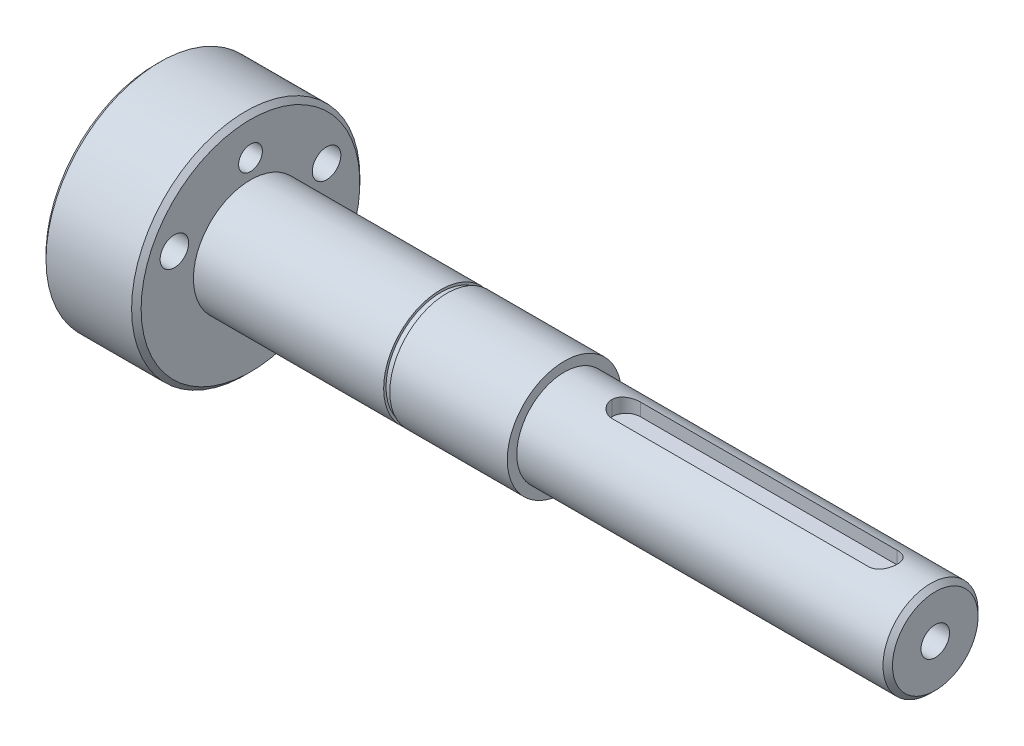
ISO-10303-21;
HEADER;
FILE_DESCRIPTION(('STEP AP214'),'2;1');
FILE_NAME('part.step','',(''),(''),'','','');
FILE_SCHEMA(('AUTOMOTIVE_DESIGN { 1 0 10303 214 1 1 1 1 }'));
ENDSEC;
DATA;
#1=APPLICATION_CONTEXT('core data for automotive mechanical design processes');
#2=APPLICATION_PROTOCOL_DEFINITION('international standard','automotive_design',2000,#1);
#3=PRODUCT_CONTEXT('',#1,'mechanical');
#4=PRODUCT('Part','Part','',(#3));
#5=PRODUCT_RELATED_PRODUCT_CATEGORY('part','',(#4));
#6=PRODUCT_DEFINITION_FORMATION('','',#4);
#7=PRODUCT_DEFINITION_CONTEXT('part definition',#1,'design');
#8=PRODUCT_DEFINITION('design','',#6,#7);
#9=PRODUCT_DEFINITION_SHAPE('','',#8);
#10=(LENGTH_UNIT() NAMED_UNIT(*) SI_UNIT(.MILLI.,.METRE.));
#11=(NAMED_UNIT(*) PLANE_ANGLE_UNIT() SI_UNIT($,.RADIAN.));
#12=(NAMED_UNIT(*) SI_UNIT($,.STERADIAN.) SOLID_ANGLE_UNIT());
#13=UNCERTAINTY_MEASURE_WITH_UNIT(LENGTH_MEASURE(1.E-05),#10,'distance_accuracy_value','');
#14=(GEOMETRIC_REPRESENTATION_CONTEXT(3) GLOBAL_UNCERTAINTY_ASSIGNED_CONTEXT((#13)) GLOBAL_UNIT_ASSIGNED_CONTEXT((#10,
#11,#12)) REPRESENTATION_CONTEXT('',''));
#15=CARTESIAN_POINT('',(0.,0.,0.));
#16=DIRECTION('',(0.,0.,1.));
#17=DIRECTION('',(1.,0.,0.));
#18=AXIS2_PLACEMENT_3D('',#15,#16,#17);
#19=CARTESIAN_POINT('',(0.,0.,0.));
#20=DIRECTION('',(-1.,0.,0.));
#21=DIRECTION('',(0.,0.,1.));
#22=AXIS2_PLACEMENT_3D('',#19,#20,#21);
#23=CYLINDRICAL_SURFACE('',#22,9.99999999999999);
#24=CARTESIAN_POINT('',(163.,0.,0.));
#25=DIRECTION('',(-1.,0.,0.));
#26=DIRECTION('',(0.,0.,1.));
#27=AXIS2_PLACEMENT_3D('',#24,#25,#26);
#28=CIRCLE('',#27,9.99999999999999);
#29=CARTESIAN_POINT('',(163.,0.,9.99999999999999));
#30=VERTEX_POINT('',#29);
#31=EDGE_CURVE('E46',#30,#30,#28,.T.);
#32=ORIENTED_EDGE('',*,*,#31,.T.);
#33=EDGE_LOOP('',(#32));
#34=FACE_BOUND('',#33,.T.);
#35=CARTESIAN_POINT('',(86.,0.,0.));
#36=DIRECTION('',(-1.,0.,0.));
#37=DIRECTION('',(0.,0.,1.));
#38=AXIS2_PLACEMENT_3D('',#35,#36,#37);
#39=CIRCLE('',#38,9.99999999999999);
#40=CARTESIAN_POINT('',(86.,0.,9.99999999999999));
#41=VERTEX_POINT('',#40);
#42=EDGE_CURVE('E119',#41,#41,#39,.T.);
#43=ORIENTED_EDGE('',*,*,#42,.F.);
#44=EDGE_LOOP('',(#43));
#45=FACE_BOUND('',#44,.T.);
#46=DIRECTION('',(-1.,0.,0.));
#47=VECTOR('',#46,1.);
#48=CARTESIAN_POINT('',(0.,9.53939201416945,3.));
#49=LINE('',#48,#47);
#50=CARTESIAN_POINT('',(99.,9.53939201416945,3.));
#51=VERTEX_POINT('',#50);
#52=CARTESIAN_POINT('',(153.,9.53939201416945,3.));
#53=VERTEX_POINT('',#52);
#54=EDGE_CURVE('E128',#51,#53,#49,.F.);
#55=ORIENTED_EDGE('',*,*,#54,.F.);
#56=CARTESIAN_POINT('',(99.,9.53939201416945,3.));
#57=CARTESIAN_POINT('',(98.9176616447206,9.53938054066292,3.00001028092919));
#58=CARTESIAN_POINT('',(98.8353298740387,9.54045779392468,2.9966103938752));
#59=CARTESIAN_POINT('',(98.671294777113,9.54470448571775,2.98307026420713));
#60=CARTESIAN_POINT('',(98.5895913136817,9.5478734536108,2.97293153783626));
#61=CARTESIAN_POINT('',(98.4276012203908,9.55620753798555,2.94602863460168));
#62=CARTESIAN_POINT('',(98.3473114611647,9.56136744728883,2.92928173841085));
#63=CARTESIAN_POINT('',(98.1885187369749,9.57351674919551,2.88932692619323));
#64=CARTESIAN_POINT('',(98.1100158186842,9.58050618952759,2.86611884160637));
#65=CARTESIAN_POINT('',(97.8780531937838,9.60391611506092,2.78708673739489));
#66=CARTESIAN_POINT('',(97.7279365869629,9.62278944217778,2.72182078022101));
#67=CARTESIAN_POINT('',(97.4407785228174,9.66493136751061,2.5681533150261));
#68=CARTESIAN_POINT('',(97.3037436309954,9.68820215546661,2.47974027229482));
#69=CARTESIAN_POINT('',(97.0422787850709,9.73733616423825,2.27930040049353));
#70=CARTESIAN_POINT('',(96.9183185453614,9.76325431599016,2.16667315014813));
#71=CARTESIAN_POINT('',(96.6907289172146,9.81429568962702,1.92227974972485));
#72=CARTESIAN_POINT('',(96.5871034948398,9.83941875564022,1.79050987481177));
#73=CARTESIAN_POINT('',(96.4010451211591,9.88667183343644,1.50818045237191));
#74=CARTESIAN_POINT('',(96.3191023734984,9.90872799691547,1.35728471100045));
#75=CARTESIAN_POINT('',(96.1819863591321,9.94670010628166,1.04312670278014));
#76=CARTESIAN_POINT('',(96.1267899026455,9.96262136883706,0.879875291166885));
#77=CARTESIAN_POINT('',(96.0574621078652,9.98287420040382,0.596528917969972));
#78=CARTESIAN_POINT('',(96.0359572833098,9.98925529459183,0.478332984300347));
#79=CARTESIAN_POINT('',(96.0072119502325,9.9978363572386,0.240114779876289));
#80=CARTESIAN_POINT('',(95.9999664864448,10.0000377781649,0.120093158182543));
#81=CARTESIAN_POINT('',(96.,9.99999999999999,0.));
#82=B_SPLINE_CURVE_WITH_KNOTS('',3,(#56,#57,#58,#59,#60,#61,#62,#63,#64,#65,#66,#67,#68,#69,#70,
#71,#72,#73,#74,#75,#76,#77,#78,#79,#80,#81),.UNSPECIFIED.,.F.,.F.,(4,2,2,2,2,2,2,2,2,2,2,2,4),
(0.,0.246926642096038,0.493797744336966,0.740027500587488,0.986263681104387,1.47812528182602,
1.97023245626458,2.47634460283145,2.98255536261057,3.49938590474304,4.0157675349931,
4.37580149197501,4.73571031156629),.UNSPECIFIED.);
#83=CARTESIAN_POINT('',(96.,9.99999999999999,0.));
#84=VERTEX_POINT('',#83);
#85=EDGE_CURVE('E61',#51,#84,#82,.T.);
#86=ORIENTED_EDGE('',*,*,#85,.T.);
#87=CARTESIAN_POINT('',(96.,9.99999999999999,0.));
#88=CARTESIAN_POINT('',(95.9999899174765,10.0000096080285,-0.082422763146378));
#89=CARTESIAN_POINT('',(96.0033965785664,9.99898119564176,-0.164839419523965));
#90=CARTESIAN_POINT('',(96.0169651310905,9.99491972682127,-0.3290491540422));
#91=CARTESIAN_POINT('',(96.0271256818352,9.99188706824365,-0.41084235268443));
#92=CARTESIAN_POINT('',(96.05409089747,9.98389820327521,-0.573029010046602));
#93=CARTESIAN_POINT('',(96.0708793006921,9.97894670536667,-0.653425395603842));
#94=CARTESIAN_POINT('',(96.1109371899659,9.96726244195505,-0.81243293724789));
#95=CARTESIAN_POINT('',(96.1342068027771,9.9605296416134,-0.891044058385975));
#96=CARTESIAN_POINT('',(96.2134619543286,9.93791665572713,-1.12334751869737));
#97=CARTESIAN_POINT('',(96.27892464979,9.91961224749822,-1.27369353338764));
#98=CARTESIAN_POINT('',(96.4330525770417,9.87844788158405,-1.56123419028948));
#99=CARTESIAN_POINT('',(96.5217275934305,9.8555860037779,-1.69842325310213));
#100=CARTESIAN_POINT('',(96.7224413565894,9.80701615591609,-1.95973032044496));
#101=CARTESIAN_POINT('',(96.8350212611042,9.78125020543236,-2.08342255809079));
#102=CARTESIAN_POINT('',(97.0792077291789,9.73011891154728,-2.31049087548403));
#103=CARTESIAN_POINT('',(97.2108192482871,9.70475367439975,-2.41386164723294));
#104=CARTESIAN_POINT('',(97.4929875305923,9.65667399274843,-2.59963260472334));
#105=CARTESIAN_POINT('',(97.6439077590752,9.63403315178489,-2.68150106243729));
#106=CARTESIAN_POINT('',(97.9581096897246,9.59485969620407,-2.81846982634431));
#107=CARTESIAN_POINT('',(98.1213795882123,9.57832133561774,-2.8735953286263));
#108=CARTESIAN_POINT('',(98.4045358317353,9.5572569111083,-2.94274344350912));
#109=CARTESIAN_POINT('',(98.5225073963823,9.55060700734939,-2.96416883691449));
#110=CARTESIAN_POINT('',(98.7602947850655,9.5416524923835,-2.99281255205241));
#111=CARTESIAN_POINT('',(98.8801101940191,9.5393469172089,-3.00003402552321));
#112=CARTESIAN_POINT('',(99.,9.53939201416945,-3.));
#113=B_SPLINE_CURVE_WITH_KNOTS('',3,(#87,#88,#89,#90,#91,#92,#93,#94,#95,#96,#97,#98,#99,#100,
#101,#102,#103,#104,#105,#106,#107,#108,#109,#110,#111,#112),.UNSPECIFIED.,.F.,.F.,(4,2,2,2,2,2,
2,2,2,2,2,2,4),(0.,0.24718104548786,0.494313038630552,0.740842415978006,0.987376615285058,
1.47989284612469,1.9726170206496,2.47798531493201,2.98348543731961,3.50050825438352,
4.01704300366043,4.37641607170519,4.73570938868941),.UNSPECIFIED.);
#114=CARTESIAN_POINT('',(99.,9.53939201416945,-3.));
#115=VERTEX_POINT('',#114);
#116=EDGE_CURVE('E151',#84,#115,#113,.T.);
#117=ORIENTED_EDGE('',*,*,#116,.T.);
#118=DIRECTION('',(-1.,0.,0.));
#119=VECTOR('',#118,1.);
#120=CARTESIAN_POINT('',(0.,9.53939201416945,-3.));
#121=LINE('',#120,#119);
#122=CARTESIAN_POINT('',(153.,9.53939201416945,-3.));
#123=VERTEX_POINT('',#122);
#124=EDGE_CURVE('E131',#115,#123,#121,.F.);
#125=ORIENTED_EDGE('',*,*,#124,.T.);
#126=CARTESIAN_POINT('',(153.,9.53939201416945,-3.));
#127=CARTESIAN_POINT('',(153.082338355279,9.53938054066292,-3.00001028092919));
#128=CARTESIAN_POINT('',(153.164670125961,9.54045779392468,-2.9966103938752));
#129=CARTESIAN_POINT('',(153.328705222887,9.54470448571775,-2.98307026420713));
#130=CARTESIAN_POINT('',(153.410408686318,9.5478734536108,-2.97293153783626));
#131=CARTESIAN_POINT('',(153.572398779609,9.55620753798555,-2.94602863460168));
#132=CARTESIAN_POINT('',(153.652688538835,9.56136744728883,-2.92928173841085));
#133=CARTESIAN_POINT('',(153.811481263025,9.57351674919551,-2.88932692619323));
#134=CARTESIAN_POINT('',(153.889984181316,9.58050618952759,-2.86611884160637));
#135=CARTESIAN_POINT('',(154.121946806216,9.60391611506092,-2.7870867373949));
#136=CARTESIAN_POINT('',(154.272063413037,9.62278944217777,-2.72182078022101));
#137=CARTESIAN_POINT('',(154.559221477183,9.66493136751061,-2.5681533150261));
#138=CARTESIAN_POINT('',(154.696256369005,9.68820215546661,-2.47974027229483));
#139=CARTESIAN_POINT('',(154.957721214929,9.73733616423825,-2.27930040049353));
#140=CARTESIAN_POINT('',(155.081681454639,9.76325431599016,-2.16667315014813));
#141=CARTESIAN_POINT('',(155.309271082785,9.81429568962702,-1.92227974972485));
#142=CARTESIAN_POINT('',(155.41289650516,9.83941875564022,-1.79050987481177));
#143=CARTESIAN_POINT('',(155.598954878841,9.88667183343644,-1.50818045237192));
#144=CARTESIAN_POINT('',(155.680897626502,9.90872799691547,-1.35728471100046));
#145=CARTESIAN_POINT('',(155.818013640868,9.94670010628165,-1.04312670278015));
#146=CARTESIAN_POINT('',(155.873210097355,9.96262136883706,-0.879875291166895));
#147=CARTESIAN_POINT('',(155.942537892135,9.98287420040382,-0.596528917969979));
#148=CARTESIAN_POINT('',(155.96404271669,9.98925529459183,-0.478332984300352));
#149=CARTESIAN_POINT('',(155.992788049768,9.9978363572386,-0.240114779876292));
#150=CARTESIAN_POINT('',(156.000033513555,10.0000377781649,-0.120093158182545));
#151=CARTESIAN_POINT('',(156.,9.99999999999999,0.));
#152=B_SPLINE_CURVE_WITH_KNOTS('',3,(#126,#127,#128,#129,#130,#131,#132,#133,#134,#135,#136,
#137,#138,#139,#140,#141,#142,#143,#144,#145,#146,#147,#148,#149,#150,#151),.UNSPECIFIED.,.F.,
.F.,(4,2,2,2,2,2,2,2,2,2,2,2,4),(0.,0.246926642096038,0.493797744336966,0.740027500587474,
0.986263681104372,1.47812528182599,1.97023245626457,2.47634460283146,2.98255536261056,
3.49938590474304,4.0157675349931,4.37580149197501,4.73571031156629),.UNSPECIFIED.);
#153=CARTESIAN_POINT('',(156.,9.99999999999999,0.));
#154=VERTEX_POINT('',#153);
#155=EDGE_CURVE('E54',#123,#154,#152,.T.);
#156=ORIENTED_EDGE('',*,*,#155,.T.);
#157=CARTESIAN_POINT('',(156.,9.99999999999999,0.));
#158=CARTESIAN_POINT('',(156.000010082523,10.0000096080285,0.0824227631463772));
#159=CARTESIAN_POINT('',(155.996603421434,9.99898119564177,0.164839419523966));
#160=CARTESIAN_POINT('',(155.983034868909,9.99491972682127,0.329049154042203));
#161=CARTESIAN_POINT('',(155.972874318165,9.99188706824365,0.410842352684435));
#162=CARTESIAN_POINT('',(155.94590910253,9.98389820327521,0.573029010046605));
#163=CARTESIAN_POINT('',(155.929120699308,9.97894670536667,0.653425395603843));
#164=CARTESIAN_POINT('',(155.889062810034,9.96726244195505,0.812432937247889));
#165=CARTESIAN_POINT('',(155.865793197223,9.9605296416134,0.891044058385975));
#166=CARTESIAN_POINT('',(155.786538045671,9.93791665572713,1.12334751869737));
#167=CARTESIAN_POINT('',(155.72107535021,9.91961224749822,1.27369353338764));
#168=CARTESIAN_POINT('',(155.566947422958,9.87844788158405,1.56123419028948));
#169=CARTESIAN_POINT('',(155.47827240657,9.8555860037779,1.69842325310214));
#170=CARTESIAN_POINT('',(155.277558643411,9.80701615591609,1.95973032044497));
#171=CARTESIAN_POINT('',(155.164978738896,9.78125020543236,2.0834225580908));
#172=CARTESIAN_POINT('',(154.920792270821,9.73011891154728,2.31049087548403));
#173=CARTESIAN_POINT('',(154.789180751713,9.70475367439975,2.41386164723295));
#174=CARTESIAN_POINT('',(154.507012469408,9.65667399274843,2.59963260472335));
#175=CARTESIAN_POINT('',(154.356092240925,9.63403315178489,2.68150106243728));
#176=CARTESIAN_POINT('',(154.041890310275,9.59485969620407,2.81846982634431));
#177=CARTESIAN_POINT('',(153.878620411788,9.57832133561774,2.8735953286263));
#178=CARTESIAN_POINT('',(153.595464168265,9.5572569111083,2.94274344350913));
#179=CARTESIAN_POINT('',(153.477492603618,9.55060700734939,2.96416883691449));
#180=CARTESIAN_POINT('',(153.239705214935,9.5416524923835,2.9928125520524));
#181=CARTESIAN_POINT('',(153.119889805981,9.5393469172089,3.00003402552321));
#182=CARTESIAN_POINT('',(153.,9.53939201416945,3.));
#183=B_SPLINE_CURVE_WITH_KNOTS('',3,(#157,#158,#159,#160,#161,#162,#163,#164,#165,#166,#167,
#168,#169,#170,#171,#172,#173,#174,#175,#176,#177,#178,#179,#180,#181,#182),.UNSPECIFIED.,.F.,
.F.,(4,2,2,2,2,2,2,2,2,2,2,2,4),(0.,0.247181045487862,0.494313038630556,0.740842415978007,
0.98737661528506,1.47989284612469,1.9726170206496,2.47798531493203,2.98348543731961,
3.5005082543835,4.01704300366041,4.37641607170518,4.73570938868941),.UNSPECIFIED.);
#184=EDGE_CURVE('E188',#154,#53,#183,.T.);
#185=ORIENTED_EDGE('',*,*,#184,.T.);
#186=EDGE_LOOP('',(#55,#86,#117,#125,#156,#185));
#187=FACE_BOUND('',#186,.T.);
#188=ADVANCED_FACE('F37',(#34,#45,#187),#23,.T.);
#189=CARTESIAN_POINT('',(0.,0.,0.));
#190=DIRECTION('',(-1.,0.,0.));
#191=DIRECTION('',(0.,0.,1.));
#192=AXIS2_PLACEMENT_3D('',#189,#190,#191);
#193=CYLINDRICAL_SURFACE('',#192,12.);
#194=CARTESIAN_POINT('',(86.,0.,0.));
#195=DIRECTION('',(-1.,0.,0.));
#196=DIRECTION('',(0.,0.,1.));
#197=AXIS2_PLACEMENT_3D('',#194,#195,#196);
#198=CIRCLE('',#197,12.);
#199=CARTESIAN_POINT('',(86.,0.,12.));
#200=VERTEX_POINT('',#199);
#201=EDGE_CURVE('E122',#200,#200,#198,.T.);
#202=ORIENTED_EDGE('',*,*,#201,.T.);
#203=EDGE_LOOP('',(#202));
#204=FACE_BOUND('',#203,.T.);
#205=CARTESIAN_POINT('',(61.3,0.,0.));
#206=DIRECTION('',(-1.,0.,0.));
#207=DIRECTION('',(0.,0.,1.));
#208=AXIS2_PLACEMENT_3D('',#205,#206,#207);
#209=CIRCLE('',#208,12.);
#210=CARTESIAN_POINT('',(61.3,0.,12.));
#211=VERTEX_POINT('',#210);
#212=EDGE_CURVE('E110',#211,#211,#209,.T.);
#213=ORIENTED_EDGE('',*,*,#212,.F.);
#214=EDGE_LOOP('',(#213));
#215=FACE_BOUND('',#214,.T.);
#216=ADVANCED_FACE('F247',(#204,#215),#193,.T.);
#217=CARTESIAN_POINT('',(86.,12.,0.));
#218=DIRECTION('',(-1.,0.,0.));
#219=DIRECTION('',(0.,0.,1.));
#220=AXIS2_PLACEMENT_3D('',#217,#218,#219);
#221=PLANE('',#220);
#222=ORIENTED_EDGE('',*,*,#201,.F.);
#223=EDGE_LOOP('',(#222));
#224=FACE_BOUND('',#223,.T.);
#225=ORIENTED_EDGE('',*,*,#42,.T.);
#226=EDGE_LOOP('',(#225));
#227=FACE_BOUND('',#226,.T.);
#228=ADVANCED_FACE('F249',(#224,#227),#221,.F.);
#229=CARTESIAN_POINT('',(164.,9.99999999999999,0.));
#230=DIRECTION('',(-1.,0.,0.));
#231=DIRECTION('',(0.,0.,1.));
#232=AXIS2_PLACEMENT_3D('',#229,#230,#231);
#233=PLANE('',#232);
#234=CARTESIAN_POINT('',(164.,0.,0.));
#235=DIRECTION('',(-1.,0.,0.));
#236=DIRECTION('',(0.,0.,1.));
#237=AXIS2_PLACEMENT_3D('',#234,#235,#236);
#238=CIRCLE('',#237,8.99999999999999);
#239=CARTESIAN_POINT('',(164.,0.,8.99999999999999));
#240=VERTEX_POINT('',#239);
#241=EDGE_CURVE('E11',#240,#240,#238,.F.);
#242=ORIENTED_EDGE('',*,*,#241,.T.);
#243=EDGE_LOOP('',(#242));
#244=FACE_BOUND('',#243,.T.);
#245=CARTESIAN_POINT('',(164.,0.,0.));
#246=DIRECTION('',(1.,0.,0.));
#247=DIRECTION('',(0.,0.,-1.));
#248=AXIS2_PLACEMENT_3D('',#245,#246,#247);
#249=CIRCLE('',#248,3.);
#250=CARTESIAN_POINT('',(164.,0.,-3.));
#251=VERTEX_POINT('',#250);
#252=EDGE_CURVE('E116',#251,#251,#249,.T.);
#253=ORIENTED_EDGE('',*,*,#252,.F.);
#254=EDGE_LOOP('',(#253));
#255=FACE_BOUND('',#254,.T.);
#256=ADVANCED_FACE('F257',(#244,#255),#233,.F.);
#257=CARTESIAN_POINT('',(164.,0.,0.));
#258=DIRECTION('',(1.,0.,0.));
#259=DIRECTION('',(0.,0.,-1.));
#260=AXIS2_PLACEMENT_3D('',#257,#258,#259);
#261=CYLINDRICAL_SURFACE('',#260,3.);
#262=CARTESIAN_POINT('',(152.,0.,0.));
#263=DIRECTION('',(1.,0.,0.));
#264=DIRECTION('',(0.,0.,-1.));
#265=AXIS2_PLACEMENT_3D('',#262,#263,#264);
#266=CIRCLE('',#265,3.);
#267=CARTESIAN_POINT('',(152.,0.,-3.));
#268=VERTEX_POINT('',#267);
#269=EDGE_CURVE('E107',#268,#268,#266,.T.);
#270=ORIENTED_EDGE('',*,*,#269,.F.);
#271=EDGE_LOOP('',(#270));
#272=FACE_BOUND('',#271,.T.);
#273=ORIENTED_EDGE('',*,*,#252,.T.);
#274=EDGE_LOOP('',(#273));
#275=FACE_BOUND('',#274,.T.);
#276=ADVANCED_FACE('F291',(#272,#275),#261,.F.);
#277=CARTESIAN_POINT('',(152.,2.5,0.));
#278=DIRECTION('',(-1.,0.,0.));
#279=DIRECTION('',(0.,0.,1.));
#280=AXIS2_PLACEMENT_3D('',#277,#278,#279);
#281=PLANE('',#280);
#282=CARTESIAN_POINT('',(152.,0.,0.));
#283=DIRECTION('',(1.,0.,0.));
#284=DIRECTION('',(0.,0.,-1.));
#285=AXIS2_PLACEMENT_3D('',#282,#283,#284);
#286=CIRCLE('',#285,2.5);
#287=CARTESIAN_POINT('',(152.,0.,-2.5));
#288=VERTEX_POINT('',#287);
#289=EDGE_CURVE('E103',#288,#288,#286,.T.);
#290=ORIENTED_EDGE('',*,*,#289,.F.);
#291=EDGE_LOOP('',(#290));
#292=FACE_BOUND('',#291,.T.);
#293=ORIENTED_EDGE('',*,*,#269,.T.);
#294=EDGE_LOOP('',(#293));
#295=FACE_BOUND('',#294,.T.);
#296=ADVANCED_FACE('F288',(#292,#295),#281,.F.);
#297=CARTESIAN_POINT('',(164.,0.,0.));
#298=DIRECTION('',(1.,0.,0.));
#299=DIRECTION('',(0.,0.,-1.));
#300=AXIS2_PLACEMENT_3D('',#297,#298,#299);
#301=CYLINDRICAL_SURFACE('',#300,2.5);
#302=CARTESIAN_POINT('',(147.,0.,0.));
#303=DIRECTION('',(1.,0.,0.));
#304=DIRECTION('',(0.,0.,-1.));
#305=AXIS2_PLACEMENT_3D('',#302,#303,#304);
#306=CIRCLE('',#305,2.5);
#307=CARTESIAN_POINT('',(147.,0.,-2.5));
#308=VERTEX_POINT('',#307);
#309=EDGE_CURVE('E101',#308,#308,#306,.T.);
#310=ORIENTED_EDGE('',*,*,#309,.F.);
#311=EDGE_LOOP('',(#310));
#312=FACE_BOUND('',#311,.T.);
#313=ORIENTED_EDGE('',*,*,#289,.T.);
#314=EDGE_LOOP('',(#313));
#315=FACE_BOUND('',#314,.T.);
#316=ADVANCED_FACE('F97',(#312,#315),#301,.F.);
#317=CARTESIAN_POINT('',(147.,0.,0.));
#318=DIRECTION('',(1.,0.,0.));
#319=DIRECTION('',(0.,0.,-1.));
#320=AXIS2_PLACEMENT_3D('',#317,#318,#319);
#321=CONICAL_SURFACE('',#320,2.5,1.02974425867665);
#322=CARTESIAN_POINT('',(145.497848452431,0.,0.));
#323=VERTEX_POINT('',#322);
#324=VERTEX_LOOP('',#323);
#325=FACE_BOUND('',#324,.T.);
#326=ORIENTED_EDGE('',*,*,#309,.T.);
#327=EDGE_LOOP('',(#326));
#328=FACE_BOUND('',#327,.T.);
#329=ADVANCED_FACE('F93',(#325,#328),#321,.F.);
#330=CARTESIAN_POINT('',(60.,11.5,0.));
#331=DIRECTION('',(1.,0.,0.));
#332=DIRECTION('',(0.,0.,-1.));
#333=AXIS2_PLACEMENT_3D('',#330,#331,#332);
#334=PLANE('',#333);
#335=CARTESIAN_POINT('',(60.,0.,0.));
#336=DIRECTION('',(-1.,0.,0.));
#337=DIRECTION('',(0.,0.,1.));
#338=AXIS2_PLACEMENT_3D('',#335,#336,#337);
#339=CIRCLE('',#338,11.5);
#340=CARTESIAN_POINT('',(60.,0.,11.5));
#341=VERTEX_POINT('',#340);
#342=EDGE_CURVE('E236',#341,#341,#339,.T.);
#343=ORIENTED_EDGE('',*,*,#342,.T.);
#344=EDGE_LOOP('',(#343));
#345=FACE_BOUND('',#344,.T.);
#346=CARTESIAN_POINT('',(60.,0.,0.));
#347=DIRECTION('',(-1.,0.,0.));
#348=DIRECTION('',(0.,0.,1.));
#349=AXIS2_PLACEMENT_3D('',#346,#347,#348);
#350=CIRCLE('',#349,12.);
#351=CARTESIAN_POINT('',(60.,0.,12.));
#352=VERTEX_POINT('',#351);
#353=EDGE_CURVE('E104',#352,#352,#350,.T.);
#354=ORIENTED_EDGE('',*,*,#353,.F.);
#355=EDGE_LOOP('',(#354));
#356=FACE_BOUND('',#355,.T.);
#357=ADVANCED_FACE('F96',(#345,#356),#334,.T.);
#358=CARTESIAN_POINT('',(61.3,11.5,0.));
#359=DIRECTION('',(-1.,0.,0.));
#360=DIRECTION('',(0.,0.,1.));
#361=AXIS2_PLACEMENT_3D('',#358,#359,#360);
#362=PLANE('',#361);
#363=ORIENTED_EDGE('',*,*,#212,.T.);
#364=EDGE_LOOP('',(#363));
#365=FACE_BOUND('',#364,.T.);
#366=CARTESIAN_POINT('',(61.3,0.,0.));
#367=DIRECTION('',(-1.,0.,0.));
#368=DIRECTION('',(0.,0.,1.));
#369=AXIS2_PLACEMENT_3D('',#366,#367,#368);
#370=CIRCLE('',#369,11.5);
#371=CARTESIAN_POINT('',(61.3,0.,11.5));
#372=VERTEX_POINT('',#371);
#373=EDGE_CURVE('E239',#372,#372,#370,.T.);
#374=ORIENTED_EDGE('',*,*,#373,.F.);
#375=EDGE_LOOP('',(#374));
#376=FACE_BOUND('',#375,.T.);
#377=ADVANCED_FACE('F244',(#365,#376),#362,.T.);
#378=CARTESIAN_POINT('',(0.,0.,0.));
#379=DIRECTION('',(-1.,0.,0.));
#380=DIRECTION('',(0.,0.,1.));
#381=AXIS2_PLACEMENT_3D('',#378,#379,#380);
#382=CYLINDRICAL_SURFACE('',#381,11.5);
#383=ORIENTED_EDGE('',*,*,#373,.T.);
#384=EDGE_LOOP('',(#383));
#385=FACE_BOUND('',#384,.T.);
#386=ORIENTED_EDGE('',*,*,#342,.F.);
#387=EDGE_LOOP('',(#386));
#388=FACE_BOUND('',#387,.T.);
#389=ADVANCED_FACE('F282',(#385,#388),#382,.T.);
#390=CARTESIAN_POINT('',(0.,0.,0.));
#391=DIRECTION('',(1.,0.,0.));
#392=DIRECTION('',(0.,0.,-1.));
#393=AXIS2_PLACEMENT_3D('',#390,#391,#392);
#394=PLANE('',#393);
#395=CARTESIAN_POINT('',(0.,16.,0.));
#396=DIRECTION('',(-1.,0.,0.));
#397=DIRECTION('',(0.,0.,1.));
#398=AXIS2_PLACEMENT_3D('',#395,#396,#397);
#399=CIRCLE('',#398,2.5);
#400=CARTESIAN_POINT('',(0.,16.,2.5));
#401=VERTEX_POINT('',#400);
#402=EDGE_CURVE('E222',#401,#401,#399,.T.);
#403=ORIENTED_EDGE('',*,*,#402,.F.);
#404=EDGE_LOOP('',(#403));
#405=FACE_BOUND('',#404,.T.);
#406=CARTESIAN_POINT('',(0.,7.,16.));
#407=DIRECTION('',(-1.,0.,0.));
#408=DIRECTION('',(0.,0.,1.));
#409=AXIS2_PLACEMENT_3D('',#406,#407,#408);
#410=CIRCLE('',#409,3.);
#411=CARTESIAN_POINT('',(0.,7.,19.));
#412=VERTEX_POINT('',#411);
#413=EDGE_CURVE('E212',#412,#412,#410,.T.);
#414=ORIENTED_EDGE('',*,*,#413,.F.);
#415=EDGE_LOOP('',(#414));
#416=FACE_BOUND('',#415,.T.);
#417=CARTESIAN_POINT('',(0.,7.,-16.));
#418=DIRECTION('',(-1.,0.,0.));
#419=DIRECTION('',(0.,0.,1.));
#420=AXIS2_PLACEMENT_3D('',#417,#418,#419);
#421=CIRCLE('',#420,3.);
#422=CARTESIAN_POINT('',(0.,7.,-13.));
#423=VERTEX_POINT('',#422);
#424=EDGE_CURVE('E209',#423,#423,#421,.T.);
#425=ORIENTED_EDGE('',*,*,#424,.F.);
#426=EDGE_LOOP('',(#425));
#427=FACE_BOUND('',#426,.T.);
#428=CARTESIAN_POINT('',(0.,0.,0.));
#429=DIRECTION('',(1.,0.,0.));
#430=DIRECTION('',(0.,0.,-1.));
#431=AXIS2_PLACEMENT_3D('',#428,#429,#430);
#432=CIRCLE('',#431,23.);
#433=CARTESIAN_POINT('',(0.,0.,-23.));
#434=VERTEX_POINT('',#433);
#435=EDGE_CURVE('E200',#434,#434,#432,.F.);
#436=ORIENTED_EDGE('',*,*,#435,.T.);
#437=EDGE_LOOP('',(#436));
#438=FACE_BOUND('',#437,.T.);
#439=ADVANCED_FACE('F39',(#405,#416,#427,#438),#394,.F.);
#440=CARTESIAN_POINT('',(0.,0.,0.));
#441=DIRECTION('',(-1.,0.,0.));
#442=DIRECTION('',(0.,0.,1.));
#443=AXIS2_PLACEMENT_3D('',#440,#441,#442);
#444=CYLINDRICAL_SURFACE('',#443,24.);
#445=CARTESIAN_POINT('',(19.,0.,0.));
#446=DIRECTION('',(-1.,0.,0.));
#447=DIRECTION('',(0.,0.,1.));
#448=AXIS2_PLACEMENT_3D('',#445,#446,#447);
#449=CIRCLE('',#448,24.);
#450=CARTESIAN_POINT('',(19.,0.,24.));
#451=VERTEX_POINT('',#450);
#452=EDGE_CURVE('E194',#451,#451,#449,.T.);
#453=ORIENTED_EDGE('',*,*,#452,.T.);
#454=EDGE_LOOP('',(#453));
#455=FACE_BOUND('',#454,.T.);
#456=CARTESIAN_POINT('',(1.00000000000001,0.,0.));
#457=DIRECTION('',(1.,0.,0.));
#458=DIRECTION('',(0.,0.,-1.));
#459=AXIS2_PLACEMENT_3D('',#456,#457,#458);
#460=CIRCLE('',#459,24.);
#461=CARTESIAN_POINT('',(1.00000000000001,0.,-24.));
#462=VERTEX_POINT('',#461);
#463=EDGE_CURVE('E187',#462,#462,#460,.T.);
#464=ORIENTED_EDGE('',*,*,#463,.T.);
#465=EDGE_LOOP('',(#464));
#466=FACE_BOUND('',#465,.T.);
#467=ADVANCED_FACE('F270',(#455,#466),#444,.T.);
#468=CARTESIAN_POINT('',(20.,24.,0.));
#469=DIRECTION('',(-1.,0.,0.));
#470=DIRECTION('',(0.,0.,1.));
#471=AXIS2_PLACEMENT_3D('',#468,#469,#470);
#472=PLANE('',#471);
#473=CARTESIAN_POINT('',(20.,16.,0.));
#474=DIRECTION('',(-1.,0.,0.));
#475=DIRECTION('',(0.,0.,1.));
#476=AXIS2_PLACEMENT_3D('',#473,#474,#475);
#477=CIRCLE('',#476,2.5);
#478=CARTESIAN_POINT('',(20.,16.,2.5));
#479=VERTEX_POINT('',#478);
#480=EDGE_CURVE('E41',#479,#479,#477,.T.);
#481=ORIENTED_EDGE('',*,*,#480,.T.);
#482=EDGE_LOOP('',(#481));
#483=FACE_BOUND('',#482,.T.);
#484=CARTESIAN_POINT('',(20.,7.,16.));
#485=DIRECTION('',(-1.,0.,0.));
#486=DIRECTION('',(0.,0.,1.));
#487=AXIS2_PLACEMENT_3D('',#484,#485,#486);
#488=CIRCLE('',#487,3.);
#489=CARTESIAN_POINT('',(20.,7.,19.));
#490=VERTEX_POINT('',#489);
#491=EDGE_CURVE('E210',#490,#490,#488,.T.);
#492=ORIENTED_EDGE('',*,*,#491,.T.);
#493=EDGE_LOOP('',(#492));
#494=FACE_BOUND('',#493,.T.);
#495=CARTESIAN_POINT('',(20.,7.,-16.));
#496=DIRECTION('',(-1.,0.,0.));
#497=DIRECTION('',(0.,0.,1.));
#498=AXIS2_PLACEMENT_3D('',#495,#496,#497);
#499=CIRCLE('',#498,3.);
#500=CARTESIAN_POINT('',(20.,7.,-13.));
#501=VERTEX_POINT('',#500);
#502=EDGE_CURVE('E206',#501,#501,#499,.T.);
#503=ORIENTED_EDGE('',*,*,#502,.T.);
#504=EDGE_LOOP('',(#503));
#505=FACE_BOUND('',#504,.T.);
#506=CARTESIAN_POINT('',(20.,0.,0.));
#507=DIRECTION('',(-1.,0.,0.));
#508=DIRECTION('',(0.,0.,1.));
#509=AXIS2_PLACEMENT_3D('',#506,#507,#508);
#510=CIRCLE('',#509,23.);
#511=CARTESIAN_POINT('',(20.,0.,23.));
#512=VERTEX_POINT('',#511);
#513=EDGE_CURVE('E197',#512,#512,#510,.F.);
#514=ORIENTED_EDGE('',*,*,#513,.T.);
#515=EDGE_LOOP('',(#514));
#516=FACE_BOUND('',#515,.T.);
#517=CARTESIAN_POINT('',(20.,0.,0.));
#518=DIRECTION('',(-1.,0.,0.));
#519=DIRECTION('',(0.,0.,1.));
#520=AXIS2_PLACEMENT_3D('',#517,#518,#519);
#521=CIRCLE('',#520,12.);
#522=CARTESIAN_POINT('',(20.,0.,12.));
#523=VERTEX_POINT('',#522);
#524=EDGE_CURVE('E125',#523,#523,#521,.T.);
#525=ORIENTED_EDGE('',*,*,#524,.T.);
#526=EDGE_LOOP('',(#525));
#527=FACE_BOUND('',#526,.T.);
#528=ADVANCED_FACE('F263',(#483,#494,#505,#516,#527),#472,.F.);
#529=ORIENTED_EDGE('',*,*,#524,.F.);
#530=EDGE_LOOP('',(#529));
#531=FACE_BOUND('',#530,.T.);
#532=ORIENTED_EDGE('',*,*,#353,.T.);
#533=EDGE_LOOP('',(#532));
#534=FACE_BOUND('',#533,.T.);
#535=ADVANCED_FACE('F252',(#531,#534),#193,.T.);
#536=CARTESIAN_POINT('',(96.,9.99999999999999,-3.));
#537=DIRECTION('',(0.,0.,-1.));
#538=DIRECTION('',(-1.,0.,0.));
#539=AXIS2_PLACEMENT_3D('',#536,#537,#538);
#540=PLANE('',#539);
#541=ORIENTED_EDGE('',*,*,#124,.F.);
#542=DIRECTION('',(0.,-1.,0.));
#543=VECTOR('',#542,1.);
#544=CARTESIAN_POINT('',(99.,6.85436361145361,-3.));
#545=LINE('',#544,#543);
#546=CARTESIAN_POINT('',(99.,6.85436361145361,-3.));
#547=VERTEX_POINT('',#546);
#548=EDGE_CURVE('E136',#115,#547,#545,.T.);
#549=ORIENTED_EDGE('',*,*,#548,.T.);
#550=DIRECTION('',(1.,0.,0.));
#551=VECTOR('',#550,1.);
#552=CARTESIAN_POINT('',(96.,6.85436361145361,-3.));
#553=LINE('',#552,#551);
#554=CARTESIAN_POINT('',(153.,6.85436361145361,-3.));
#555=VERTEX_POINT('',#554);
#556=EDGE_CURVE('E233',#547,#555,#553,.T.);
#557=ORIENTED_EDGE('',*,*,#556,.T.);
#558=DIRECTION('',(0.,1.,0.));
#559=VECTOR('',#558,1.);
#560=CARTESIAN_POINT('',(153.,9.53939201416945,-3.));
#561=LINE('',#560,#559);
#562=EDGE_CURVE('E133',#555,#123,#561,.T.);
#563=ORIENTED_EDGE('',*,*,#562,.T.);
#564=EDGE_LOOP('',(#541,#549,#557,#563));
#565=FACE_BOUND('',#564,.T.);
#566=ADVANCED_FACE('F262',(#565),#540,.F.);
#567=CARTESIAN_POINT('',(96.,9.99999999999999,3.));
#568=DIRECTION('',(0.,0.,-1.));
#569=DIRECTION('',(-1.,0.,0.));
#570=AXIS2_PLACEMENT_3D('',#567,#568,#569);
#571=PLANE('',#570);
#572=ORIENTED_EDGE('',*,*,#54,.T.);
#573=DIRECTION('',(0.,1.,0.));
#574=VECTOR('',#573,1.);
#575=CARTESIAN_POINT('',(153.,9.99999999999999,3.));
#576=LINE('',#575,#574);
#577=CARTESIAN_POINT('',(153.,6.85436361145361,3.));
#578=VERTEX_POINT('',#577);
#579=EDGE_CURVE('E149',#53,#578,#576,.F.);
#580=ORIENTED_EDGE('',*,*,#579,.T.);
#581=DIRECTION('',(1.,0.,0.));
#582=VECTOR('',#581,1.);
#583=CARTESIAN_POINT('',(96.,6.85436361145361,3.));
#584=LINE('',#583,#582);
#585=CARTESIAN_POINT('',(99.,6.85436361145361,3.));
#586=VERTEX_POINT('',#585);
#587=EDGE_CURVE('E230',#586,#578,#584,.T.);
#588=ORIENTED_EDGE('',*,*,#587,.F.);
#589=DIRECTION('',(0.,-1.,0.));
#590=VECTOR('',#589,1.);
#591=CARTESIAN_POINT('',(99.,9.99999999999999,3.));
#592=LINE('',#591,#590);
#593=EDGE_CURVE('E147',#586,#51,#592,.F.);
#594=ORIENTED_EDGE('',*,*,#593,.T.);
#595=EDGE_LOOP('',(#572,#580,#588,#594));
#596=FACE_BOUND('',#595,.T.);
#597=ADVANCED_FACE('F180',(#596),#571,.T.);
#598=CARTESIAN_POINT('',(96.,6.85436361145361,-3.));
#599=DIRECTION('',(0.,-1.,0.));
#600=DIRECTION('',(0.,0.,-1.));
#601=AXIS2_PLACEMENT_3D('',#598,#599,#600);
#602=PLANE('',#601);
#603=CARTESIAN_POINT('',(153.,6.85436361145361,0.));
#604=DIRECTION('',(0.,-1.,0.));
#605=DIRECTION('',(0.,0.,-1.));
#606=AXIS2_PLACEMENT_3D('',#603,#604,#605);
#607=CIRCLE('',#606,3.);
#608=CARTESIAN_POINT('',(156.,6.85436361145361,0.));
#609=VERTEX_POINT('',#608);
#610=EDGE_CURVE('E143',#578,#609,#607,.F.);
#611=ORIENTED_EDGE('',*,*,#610,.T.);
#612=CARTESIAN_POINT('',(153.,6.85436361145361,0.));
#613=DIRECTION('',(0.,-1.,0.));
#614=DIRECTION('',(0.,0.,-1.));
#615=AXIS2_PLACEMENT_3D('',#612,#613,#614);
#616=CIRCLE('',#615,3.);
#617=EDGE_CURVE('E145',#609,#555,#616,.F.);
#618=ORIENTED_EDGE('',*,*,#617,.T.);
#619=ORIENTED_EDGE('',*,*,#556,.F.);
#620=CARTESIAN_POINT('',(99.,6.85436361145361,0.));
#621=DIRECTION('',(0.,-1.,0.));
#622=DIRECTION('',(0.,0.,-1.));
#623=AXIS2_PLACEMENT_3D('',#620,#621,#622);
#624=CIRCLE('',#623,3.);
#625=CARTESIAN_POINT('',(96.,6.85436361145361,0.));
#626=VERTEX_POINT('',#625);
#627=EDGE_CURVE('E141',#547,#626,#624,.F.);
#628=ORIENTED_EDGE('',*,*,#627,.T.);
#629=CARTESIAN_POINT('',(99.,6.85436361145361,0.));
#630=DIRECTION('',(0.,-1.,0.));
#631=DIRECTION('',(0.,0.,-1.));
#632=AXIS2_PLACEMENT_3D('',#629,#630,#631);
#633=CIRCLE('',#632,3.);
#634=EDGE_CURVE('E139',#626,#586,#633,.F.);
#635=ORIENTED_EDGE('',*,*,#634,.T.);
#636=ORIENTED_EDGE('',*,*,#587,.T.);
#637=EDGE_LOOP('',(#611,#618,#619,#628,#635,#636));
#638=FACE_BOUND('',#637,.T.);
#639=ADVANCED_FACE('F178',(#638),#602,.F.);
#640=CARTESIAN_POINT('',(99.,6.85436361145361,0.));
#641=DIRECTION('',(0.,-1.,0.));
#642=DIRECTION('',(0.,0.,-1.));
#643=AXIS2_PLACEMENT_3D('',#640,#641,#642);
#644=CYLINDRICAL_SURFACE('',#643,3.);
#645=DIRECTION('',(0.,-1.,0.));
#646=VECTOR('',#645,1.);
#647=CARTESIAN_POINT('',(96.,6.85436361145361,0.));
#648=LINE('',#647,#646);
#649=EDGE_CURVE('E227',#84,#626,#648,.T.);
#650=ORIENTED_EDGE('',*,*,#649,.F.);
#651=ORIENTED_EDGE('',*,*,#85,.F.);
#652=ORIENTED_EDGE('',*,*,#593,.F.);
#653=ORIENTED_EDGE('',*,*,#634,.F.);
#654=EDGE_LOOP('',(#650,#651,#652,#653));
#655=FACE_BOUND('',#654,.T.);
#656=ADVANCED_FACE('F172',(#655),#644,.F.);
#657=CARTESIAN_POINT('',(99.,9.99999999999999,0.));
#658=DIRECTION('',(0.,1.,0.));
#659=DIRECTION('',(0.,0.,1.));
#660=AXIS2_PLACEMENT_3D('',#657,#658,#659);
#661=CYLINDRICAL_SURFACE('',#660,3.);
#662=ORIENTED_EDGE('',*,*,#116,.F.);
#663=ORIENTED_EDGE('',*,*,#649,.T.);
#664=ORIENTED_EDGE('',*,*,#627,.F.);
#665=ORIENTED_EDGE('',*,*,#548,.F.);
#666=EDGE_LOOP('',(#662,#663,#664,#665));
#667=FACE_BOUND('',#666,.T.);
#668=ADVANCED_FACE('F166',(#667),#661,.F.);
#669=CARTESIAN_POINT('',(153.,6.85436361145361,0.));
#670=DIRECTION('',(0.,1.,0.));
#671=DIRECTION('',(0.,0.,1.));
#672=AXIS2_PLACEMENT_3D('',#669,#670,#671);
#673=CYLINDRICAL_SURFACE('',#672,3.);
#674=DIRECTION('',(0.,1.,0.));
#675=VECTOR('',#674,1.);
#676=CARTESIAN_POINT('',(156.,6.85436361145361,0.));
#677=LINE('',#676,#675);
#678=EDGE_CURVE('E208',#609,#154,#677,.T.);
#679=ORIENTED_EDGE('',*,*,#678,.F.);
#680=ORIENTED_EDGE('',*,*,#610,.F.);
#681=ORIENTED_EDGE('',*,*,#579,.F.);
#682=ORIENTED_EDGE('',*,*,#184,.F.);
#683=EDGE_LOOP('',(#679,#680,#681,#682));
#684=FACE_BOUND('',#683,.T.);
#685=ADVANCED_FACE('F171',(#684),#673,.F.);
#686=CARTESIAN_POINT('',(153.,9.99999999999999,0.));
#687=DIRECTION('',(0.,-1.,0.));
#688=DIRECTION('',(0.,0.,-1.));
#689=AXIS2_PLACEMENT_3D('',#686,#687,#688);
#690=CYLINDRICAL_SURFACE('',#689,3.);
#691=ORIENTED_EDGE('',*,*,#617,.F.);
#692=ORIENTED_EDGE('',*,*,#678,.T.);
#693=ORIENTED_EDGE('',*,*,#155,.F.);
#694=ORIENTED_EDGE('',*,*,#562,.F.);
#695=EDGE_LOOP('',(#691,#692,#693,#694));
#696=FACE_BOUND('',#695,.T.);
#697=ADVANCED_FACE('F324',(#696),#690,.F.);
#698=CARTESIAN_POINT('',(19.,0.,0.));
#699=DIRECTION('',(-1.,0.,0.));
#700=DIRECTION('',(0.,0.,1.));
#701=AXIS2_PLACEMENT_3D('',#698,#699,#700);
#702=CONICAL_SURFACE('',#701,24.,0.785398163397443);
#703=ORIENTED_EDGE('',*,*,#513,.F.);
#704=EDGE_LOOP('',(#703));
#705=FACE_BOUND('',#704,.T.);
#706=ORIENTED_EDGE('',*,*,#452,.F.);
#707=EDGE_LOOP('',(#706));
#708=FACE_BOUND('',#707,.T.);
#709=ADVANCED_FACE('F357',(#705,#708),#702,.T.);
#710=CARTESIAN_POINT('',(0.,0.,0.));
#711=DIRECTION('',(1.,0.,0.));
#712=DIRECTION('',(0.,0.,-1.));
#713=AXIS2_PLACEMENT_3D('',#710,#711,#712);
#714=CONICAL_SURFACE('',#713,23.,0.785398163397454);
#715=ORIENTED_EDGE('',*,*,#463,.F.);
#716=EDGE_LOOP('',(#715));
#717=FACE_BOUND('',#716,.T.);
#718=ORIENTED_EDGE('',*,*,#435,.F.);
#719=EDGE_LOOP('',(#718));
#720=FACE_BOUND('',#719,.T.);
#721=ADVANCED_FACE('F308',(#717,#720),#714,.T.);
#722=CARTESIAN_POINT('',(163.,0.,0.));
#723=DIRECTION('',(-1.,0.,0.));
#724=DIRECTION('',(0.,0.,1.));
#725=AXIS2_PLACEMENT_3D('',#722,#723,#724);
#726=CONICAL_SURFACE('',#725,9.99999999999999,0.785398163397438);
#727=ORIENTED_EDGE('',*,*,#241,.F.);
#728=EDGE_LOOP('',(#727));
#729=FACE_BOUND('',#728,.T.);
#730=ORIENTED_EDGE('',*,*,#31,.F.);
#731=EDGE_LOOP('',(#730));
#732=FACE_BOUND('',#731,.T.);
#733=ADVANCED_FACE('F304',(#729,#732),#726,.T.);
#734=CARTESIAN_POINT('',(164.,7.,-16.));
#735=DIRECTION('',(-1.,0.,0.));
#736=DIRECTION('',(0.,0.,1.));
#737=AXIS2_PLACEMENT_3D('',#734,#735,#736);
#738=CYLINDRICAL_SURFACE('',#737,3.);
#739=ORIENTED_EDGE('',*,*,#424,.T.);
#740=EDGE_LOOP('',(#739));
#741=FACE_BOUND('',#740,.T.);
#742=ORIENTED_EDGE('',*,*,#502,.F.);
#743=EDGE_LOOP('',(#742));
#744=FACE_BOUND('',#743,.T.);
#745=ADVANCED_FACE('F307',(#741,#744),#738,.F.);
#746=CARTESIAN_POINT('',(164.,7.,16.));
#747=DIRECTION('',(-1.,0.,0.));
#748=DIRECTION('',(0.,0.,1.));
#749=AXIS2_PLACEMENT_3D('',#746,#747,#748);
#750=CYLINDRICAL_SURFACE('',#749,3.);
#751=ORIENTED_EDGE('',*,*,#413,.T.);
#752=EDGE_LOOP('',(#751));
#753=FACE_BOUND('',#752,.T.);
#754=ORIENTED_EDGE('',*,*,#491,.F.);
#755=EDGE_LOOP('',(#754));
#756=FACE_BOUND('',#755,.T.);
#757=ADVANCED_FACE('F508',(#753,#756),#750,.F.);
#758=CARTESIAN_POINT('',(164.,16.,0.));
#759=DIRECTION('',(-1.,0.,0.));
#760=DIRECTION('',(0.,0.,1.));
#761=AXIS2_PLACEMENT_3D('',#758,#759,#760);
#762=CYLINDRICAL_SURFACE('',#761,2.5);
#763=ORIENTED_EDGE('',*,*,#402,.T.);
#764=EDGE_LOOP('',(#763));
#765=FACE_BOUND('',#764,.T.);
#766=ORIENTED_EDGE('',*,*,#480,.F.);
#767=EDGE_LOOP('',(#766));
#768=FACE_BOUND('',#767,.T.);
#769=ADVANCED_FACE('F516',(#765,#768),#762,.F.);
#770=CLOSED_SHELL('',(#188,#216,#228,#256,#276,#296,#316,#329,#357,#377,#389,#439,#467,#528,
#535,#566,#597,#639,#656,#668,#685,#697,#709,#721,#733,#745,#757,#769));
#771=MANIFOLD_SOLID_BREP('B2',#770);
#772=ADVANCED_BREP_SHAPE_REPRESENTATION('',(#18,#771),#14);
#773=SHAPE_DEFINITION_REPRESENTATION(#9,#772);
ENDSEC;
END-ISO-10303-21;
